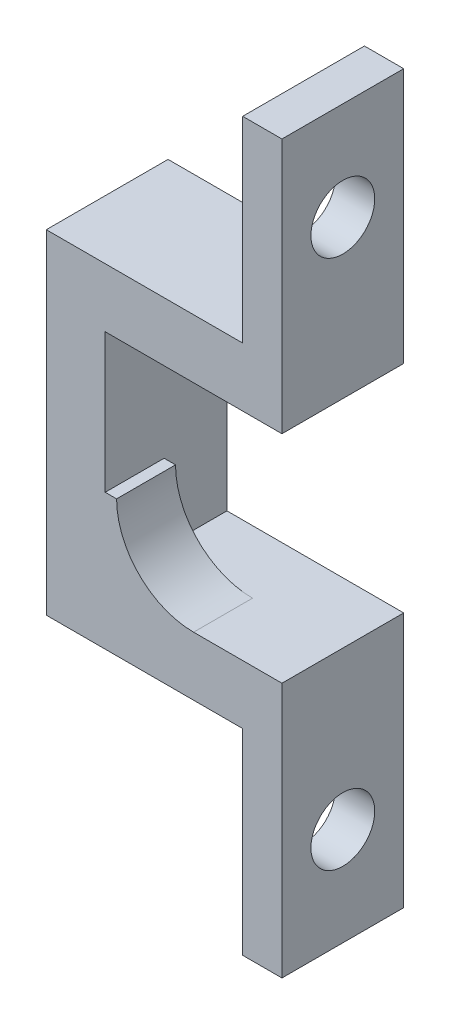
ISO-10303-21;
HEADER;
FILE_DESCRIPTION(('STEP AP214'),'2;1');
FILE_NAME('part.step','',(''),(''),'','','');
FILE_SCHEMA(('AUTOMOTIVE_DESIGN { 1 0 10303 214 1 1 1 1 }'));
ENDSEC;
DATA;
#1=APPLICATION_CONTEXT('core data for automotive mechanical design processes');
#2=APPLICATION_PROTOCOL_DEFINITION('international standard','automotive_design',2000,#1);
#3=PRODUCT_CONTEXT('',#1,'mechanical');
#4=PRODUCT('Part','Part','',(#3));
#5=PRODUCT_RELATED_PRODUCT_CATEGORY('part','',(#4));
#6=PRODUCT_DEFINITION_FORMATION('','',#4);
#7=PRODUCT_DEFINITION_CONTEXT('part definition',#1,'design');
#8=PRODUCT_DEFINITION('design','',#6,#7);
#9=PRODUCT_DEFINITION_SHAPE('','',#8);
#10=(LENGTH_UNIT() NAMED_UNIT(*) SI_UNIT(.MILLI.,.METRE.));
#11=(NAMED_UNIT(*) PLANE_ANGLE_UNIT() SI_UNIT($,.RADIAN.));
#12=(NAMED_UNIT(*) SI_UNIT($,.STERADIAN.) SOLID_ANGLE_UNIT());
#13=UNCERTAINTY_MEASURE_WITH_UNIT(LENGTH_MEASURE(1.E-05),#10,'distance_accuracy_value','');
#14=(GEOMETRIC_REPRESENTATION_CONTEXT(3) GLOBAL_UNCERTAINTY_ASSIGNED_CONTEXT((#13)) GLOBAL_UNIT_ASSIGNED_CONTEXT((#10,
#11,#12)) REPRESENTATION_CONTEXT('',''));
#15=CARTESIAN_POINT('',(0.,0.,0.));
#16=DIRECTION('',(0.,0.,1.));
#17=DIRECTION('',(1.,0.,0.));
#18=AXIS2_PLACEMENT_3D('',#15,#16,#17);
#19=CARTESIAN_POINT('',(5.8643423431886,-8.42098501040003,3.));
#20=DIRECTION('',(0.,1.,0.));
#21=DIRECTION('',(-1.,0.,0.));
#22=AXIS2_PLACEMENT_3D('',#19,#20,#21);
#23=PLANE('',#22);
#24=DIRECTION('',(0.,0.,-1.));
#25=VECTOR('',#24,1.);
#26=CARTESIAN_POINT('',(3.8643423431886,-8.42098501040003,-3.2));
#27=LINE('',#26,#25);
#28=CARTESIAN_POINT('',(3.8643423431886,-8.42098501040003,3.));
#29=VERTEX_POINT('',#28);
#30=CARTESIAN_POINT('',(3.8643423431886,-8.42098501040003,-3.2));
#31=VERTEX_POINT('',#30);
#32=EDGE_CURVE('E55',#29,#31,#27,.T.);
#33=ORIENTED_EDGE('',*,*,#32,.F.);
#34=DIRECTION('',(1.,0.,0.));
#35=VECTOR('',#34,1.);
#36=CARTESIAN_POINT('',(5.8643423431886,-8.42098501040003,3.));
#37=LINE('',#36,#35);
#38=CARTESIAN_POINT('',(-6.1356576568114,-8.42098501040003,3.));
#39=VERTEX_POINT('',#38);
#40=EDGE_CURVE('E159',#39,#29,#37,.T.);
#41=ORIENTED_EDGE('',*,*,#40,.F.);
#42=DIRECTION('',(0.,0.,-1.));
#43=VECTOR('',#42,1.);
#44=CARTESIAN_POINT('',(-6.1356576568114,-8.42098501040003,3.));
#45=LINE('',#44,#43);
#46=CARTESIAN_POINT('',(-6.1356576568114,-8.42098501040003,-3.2));
#47=VERTEX_POINT('',#46);
#48=EDGE_CURVE('E262',#39,#47,#45,.T.);
#49=ORIENTED_EDGE('',*,*,#48,.T.);
#50=DIRECTION('',(-1.,0.,0.));
#51=VECTOR('',#50,1.);
#52=CARTESIAN_POINT('',(0.,-8.42098501040003,-3.2));
#53=LINE('',#52,#51);
#54=EDGE_CURVE('E214',#31,#47,#53,.T.);
#55=ORIENTED_EDGE('',*,*,#54,.F.);
#56=EDGE_LOOP('',(#33,#41,#49,#55));
#57=FACE_BOUND('',#56,.T.);
#58=ADVANCED_FACE('F39',(#57),#23,.F.);
#59=CARTESIAN_POINT('',(-6.1356576568114,8.57901498959997,3.));
#60=DIRECTION('',(0.,-1.,0.));
#61=DIRECTION('',(0.,0.,-1.));
#62=AXIS2_PLACEMENT_3D('',#59,#60,#61);
#63=PLANE('',#62);
#64=DIRECTION('',(0.,0.,1.));
#65=VECTOR('',#64,1.);
#66=CARTESIAN_POINT('',(3.8643423431886,8.57901498959997,3.));
#67=LINE('',#66,#65);
#68=CARTESIAN_POINT('',(3.8643423431886,8.57901498959997,-3.2));
#69=VERTEX_POINT('',#68);
#70=CARTESIAN_POINT('',(3.8643423431886,8.57901498959997,3.));
#71=VERTEX_POINT('',#70);
#72=EDGE_CURVE('E63',#69,#71,#67,.T.);
#73=ORIENTED_EDGE('',*,*,#72,.F.);
#74=DIRECTION('',(1.,0.,0.));
#75=VECTOR('',#74,1.);
#76=CARTESIAN_POINT('',(0.,8.57901498959997,-3.2));
#77=LINE('',#76,#75);
#78=CARTESIAN_POINT('',(-6.1356576568114,8.57901498959997,-3.2));
#79=VERTEX_POINT('',#78);
#80=EDGE_CURVE('E219',#79,#69,#77,.T.);
#81=ORIENTED_EDGE('',*,*,#80,.F.);
#82=DIRECTION('',(0.,0.,-1.));
#83=VECTOR('',#82,1.);
#84=CARTESIAN_POINT('',(-6.1356576568114,8.57901498959997,3.));
#85=LINE('',#84,#83);
#86=CARTESIAN_POINT('',(-6.1356576568114,8.57901498959997,3.));
#87=VERTEX_POINT('',#86);
#88=EDGE_CURVE('E265',#87,#79,#85,.T.);
#89=ORIENTED_EDGE('',*,*,#88,.F.);
#90=DIRECTION('',(-1.,0.,0.));
#91=VECTOR('',#90,1.);
#92=CARTESIAN_POINT('',(-6.1356576568114,8.57901498959997,3.));
#93=LINE('',#92,#91);
#94=EDGE_CURVE('E239',#71,#87,#93,.T.);
#95=ORIENTED_EDGE('',*,*,#94,.F.);
#96=EDGE_LOOP('',(#73,#81,#89,#95));
#97=FACE_BOUND('',#96,.T.);
#98=ADVANCED_FACE('F314',(#97),#63,.F.);
#99=CARTESIAN_POINT('',(-3.1356576568114,5.57901498959997,3.));
#100=DIRECTION('',(-1.,0.,0.));
#101=DIRECTION('',(0.,-1.,0.));
#102=AXIS2_PLACEMENT_3D('',#99,#100,#101);
#103=PLANE('',#102);
#104=DIRECTION('',(0.,0.,-1.));
#105=VECTOR('',#104,1.);
#106=CARTESIAN_POINT('',(-3.1356576568114,-1.50098501040003,3.));
#107=LINE('',#106,#105);
#108=CARTESIAN_POINT('',(-3.1356576568114,-1.50098501040003,3.));
#109=VERTEX_POINT('',#108);
#110=CARTESIAN_POINT('',(-3.1356576568114,-1.50098501040003,0.));
#111=VERTEX_POINT('',#110);
#112=EDGE_CURVE('E249',#109,#111,#107,.T.);
#113=ORIENTED_EDGE('',*,*,#112,.T.);
#114=DIRECTION('',(0.,1.,0.));
#115=VECTOR('',#114,1.);
#116=CARTESIAN_POINT('',(-3.1356576568114,0.,0.));
#117=LINE('',#116,#115);
#118=CARTESIAN_POINT('',(-3.1356576568114,-5.42098501040002,0.));
#119=VERTEX_POINT('',#118);
#120=EDGE_CURVE('E205',#119,#111,#117,.T.);
#121=ORIENTED_EDGE('',*,*,#120,.F.);
#122=DIRECTION('',(0.,0.,1.));
#123=VECTOR('',#122,1.);
#124=CARTESIAN_POINT('',(-3.1356576568114,-5.42098501040002,-3.2));
#125=LINE('',#124,#123);
#126=CARTESIAN_POINT('',(-3.1356576568114,-5.42098501040002,-3.2));
#127=VERTEX_POINT('',#126);
#128=EDGE_CURVE('E227',#127,#119,#125,.T.);
#129=ORIENTED_EDGE('',*,*,#128,.F.);
#130=DIRECTION('',(0.,1.,0.));
#131=VECTOR('',#130,1.);
#132=CARTESIAN_POINT('',(-3.1356576568114,0.,-3.2));
#133=LINE('',#132,#131);
#134=CARTESIAN_POINT('',(-3.1356576568114,5.57901498959997,-3.2));
#135=VERTEX_POINT('',#134);
#136=EDGE_CURVE('E206',#127,#135,#133,.T.);
#137=ORIENTED_EDGE('',*,*,#136,.T.);
#138=DIRECTION('',(0.,0.,-1.));
#139=VECTOR('',#138,1.);
#140=CARTESIAN_POINT('',(-3.1356576568114,5.57901498959997,3.));
#141=LINE('',#140,#139);
#142=CARTESIAN_POINT('',(-3.1356576568114,5.57901498959997,3.));
#143=VERTEX_POINT('',#142);
#144=EDGE_CURVE('E43',#143,#135,#141,.T.);
#145=ORIENTED_EDGE('',*,*,#144,.F.);
#146=DIRECTION('',(0.,1.,0.));
#147=VECTOR('',#146,1.);
#148=CARTESIAN_POINT('',(-3.1356576568114,5.57901498959997,3.));
#149=LINE('',#148,#147);
#150=EDGE_CURVE('E232',#109,#143,#149,.T.);
#151=ORIENTED_EDGE('',*,*,#150,.F.);
#152=EDGE_LOOP('',(#113,#121,#129,#137,#145,#151));
#153=FACE_BOUND('',#152,.T.);
#154=ADVANCED_FACE('F41',(#153),#103,.F.);
#155=CARTESIAN_POINT('',(-3.1356576568114,5.57901498959997,3.));
#156=DIRECTION('',(0.,1.,0.));
#157=DIRECTION('',(0.,0.,1.));
#158=AXIS2_PLACEMENT_3D('',#155,#156,#157);
#159=PLANE('',#158);
#160=ORIENTED_EDGE('',*,*,#144,.T.);
#161=DIRECTION('',(-1.,0.,0.));
#162=VECTOR('',#161,1.);
#163=CARTESIAN_POINT('',(0.,5.57901498959997,-3.2));
#164=LINE('',#163,#162);
#165=CARTESIAN_POINT('',(5.8643423431886,5.57901498959997,-3.2));
#166=VERTEX_POINT('',#165);
#167=EDGE_CURVE('E224',#166,#135,#164,.T.);
#168=ORIENTED_EDGE('',*,*,#167,.F.);
#169=DIRECTION('',(0.,0.,-1.));
#170=VECTOR('',#169,1.);
#171=CARTESIAN_POINT('',(5.8643423431886,5.57901498959997,3.));
#172=LINE('',#171,#170);
#173=CARTESIAN_POINT('',(5.8643423431886,5.57901498959997,3.));
#174=VERTEX_POINT('',#173);
#175=EDGE_CURVE('E266',#174,#166,#172,.T.);
#176=ORIENTED_EDGE('',*,*,#175,.F.);
#177=DIRECTION('',(1.,0.,0.));
#178=VECTOR('',#177,1.);
#179=CARTESIAN_POINT('',(-3.1356576568114,5.57901498959997,3.));
#180=LINE('',#179,#178);
#181=EDGE_CURVE('E234',#143,#174,#180,.T.);
#182=ORIENTED_EDGE('',*,*,#181,.F.);
#183=EDGE_LOOP('',(#160,#168,#176,#182));
#184=FACE_BOUND('',#183,.T.);
#185=ADVANCED_FACE('F273',(#184),#159,.F.);
#186=CARTESIAN_POINT('',(5.8643423431886,8.57901498959997,3.));
#187=DIRECTION('',(-1.,0.,0.));
#188=DIRECTION('',(0.,-1.,0.));
#189=AXIS2_PLACEMENT_3D('',#186,#187,#188);
#190=PLANE('',#189);
#191=CARTESIAN_POINT('',(5.86434234318859,13.5790149896,-0.0999999999999995));
#192=DIRECTION('',(-1.,0.,0.));
#193=DIRECTION('',(0.,-1.,0.));
#194=AXIS2_PLACEMENT_3D('',#191,#192,#193);
#195=CIRCLE('',#194,1.625);
#196=CARTESIAN_POINT('',(5.86434234318859,11.9540149896,-0.0999999999999995));
#197=VERTEX_POINT('',#196);
#198=EDGE_CURVE('E179',#197,#197,#195,.F.);
#199=ORIENTED_EDGE('',*,*,#198,.F.);
#200=EDGE_LOOP('',(#199));
#201=FACE_BOUND('',#200,.T.);
#202=ORIENTED_EDGE('',*,*,#175,.T.);
#203=DIRECTION('',(0.,-1.,0.));
#204=VECTOR('',#203,1.);
#205=CARTESIAN_POINT('',(5.8643423431886,0.,-3.2));
#206=LINE('',#205,#204);
#207=CARTESIAN_POINT('',(5.8643423431886,18.5790149896,-3.2));
#208=VERTEX_POINT('',#207);
#209=EDGE_CURVE('E221',#208,#166,#206,.T.);
#210=ORIENTED_EDGE('',*,*,#209,.F.);
#211=DIRECTION('',(0.,0.,-1.));
#212=VECTOR('',#211,1.);
#213=CARTESIAN_POINT('',(5.8643423431886,18.5790149896,3.));
#214=LINE('',#213,#212);
#215=CARTESIAN_POINT('',(5.8643423431886,18.5790149896,3.));
#216=VERTEX_POINT('',#215);
#217=EDGE_CURVE('E188',#216,#208,#214,.T.);
#218=ORIENTED_EDGE('',*,*,#217,.F.);
#219=DIRECTION('',(0.,1.,0.));
#220=VECTOR('',#219,1.);
#221=CARTESIAN_POINT('',(5.8643423431886,8.57901498959997,3.));
#222=LINE('',#221,#220);
#223=EDGE_CURVE('E237',#174,#216,#222,.T.);
#224=ORIENTED_EDGE('',*,*,#223,.F.);
#225=EDGE_LOOP('',(#202,#210,#218,#224));
#226=FACE_BOUND('',#225,.T.);
#227=ADVANCED_FACE('F325',(#201,#226),#190,.F.);
#228=CARTESIAN_POINT('',(-6.1356576568114,-8.42098501040003,3.));
#229=DIRECTION('',(1.,0.,0.));
#230=DIRECTION('',(0.,1.,0.));
#231=AXIS2_PLACEMENT_3D('',#228,#229,#230);
#232=PLANE('',#231);
#233=ORIENTED_EDGE('',*,*,#88,.T.);
#234=DIRECTION('',(0.,1.,0.));
#235=VECTOR('',#234,1.);
#236=CARTESIAN_POINT('',(-6.1356576568114,0.,-3.2));
#237=LINE('',#236,#235);
#238=EDGE_CURVE('E216',#47,#79,#237,.T.);
#239=ORIENTED_EDGE('',*,*,#238,.F.);
#240=ORIENTED_EDGE('',*,*,#48,.F.);
#241=DIRECTION('',(0.,-1.,0.));
#242=VECTOR('',#241,1.);
#243=CARTESIAN_POINT('',(-6.1356576568114,-8.42098501040003,3.));
#244=LINE('',#243,#242);
#245=EDGE_CURVE('E241',#87,#39,#244,.T.);
#246=ORIENTED_EDGE('',*,*,#245,.F.);
#247=EDGE_LOOP('',(#233,#239,#240,#246));
#248=FACE_BOUND('',#247,.T.);
#249=ADVANCED_FACE('F323',(#248),#232,.F.);
#250=CARTESIAN_POINT('',(5.8643423431886,-5.42098501040002,3.));
#251=DIRECTION('',(-1.,0.,0.));
#252=DIRECTION('',(0.,0.,1.));
#253=AXIS2_PLACEMENT_3D('',#250,#251,#252);
#254=PLANE('',#253);
#255=CARTESIAN_POINT('',(5.8643423431886,-13.4209850104,-0.0999999999999995));
#256=DIRECTION('',(-1.,0.,0.));
#257=DIRECTION('',(0.,0.,1.));
#258=AXIS2_PLACEMENT_3D('',#255,#256,#257);
#259=CIRCLE('',#258,1.625);
#260=CARTESIAN_POINT('',(5.8643423431886,-13.4209850104,1.525));
#261=VERTEX_POINT('',#260);
#262=EDGE_CURVE('E176',#261,#261,#259,.F.);
#263=ORIENTED_EDGE('',*,*,#262,.F.);
#264=EDGE_LOOP('',(#263));
#265=FACE_BOUND('',#264,.T.);
#266=DIRECTION('',(0.,1.,0.));
#267=VECTOR('',#266,1.);
#268=CARTESIAN_POINT('',(5.8643423431886,-5.42098501040002,3.));
#269=LINE('',#268,#267);
#270=CARTESIAN_POINT('',(5.8643423431886,-18.4209850104,3.));
#271=VERTEX_POINT('',#270);
#272=CARTESIAN_POINT('',(5.8643423431886,-5.42098501040002,3.));
#273=VERTEX_POINT('',#272);
#274=EDGE_CURVE('E149',#271,#273,#269,.T.);
#275=ORIENTED_EDGE('',*,*,#274,.F.);
#276=DIRECTION('',(0.,0.,1.));
#277=VECTOR('',#276,1.);
#278=CARTESIAN_POINT('',(5.8643423431886,-18.4209850104,-3.2));
#279=LINE('',#278,#277);
#280=CARTESIAN_POINT('',(5.8643423431886,-18.4209850104,-3.2));
#281=VERTEX_POINT('',#280);
#282=EDGE_CURVE('E154',#281,#271,#279,.T.);
#283=ORIENTED_EDGE('',*,*,#282,.F.);
#284=DIRECTION('',(0.,-1.,0.));
#285=VECTOR('',#284,1.);
#286=CARTESIAN_POINT('',(5.8643423431886,0.,-3.2));
#287=LINE('',#286,#285);
#288=CARTESIAN_POINT('',(5.8643423431886,-5.42098501040002,-3.2));
#289=VERTEX_POINT('',#288);
#290=EDGE_CURVE('E212',#289,#281,#287,.T.);
#291=ORIENTED_EDGE('',*,*,#290,.F.);
#292=DIRECTION('',(0.,0.,-1.));
#293=VECTOR('',#292,1.);
#294=CARTESIAN_POINT('',(5.8643423431886,-5.42098501040002,3.));
#295=LINE('',#294,#293);
#296=EDGE_CURVE('E155',#273,#289,#295,.T.);
#297=ORIENTED_EDGE('',*,*,#296,.F.);
#298=EDGE_LOOP('',(#275,#283,#291,#297));
#299=FACE_BOUND('',#298,.T.);
#300=ADVANCED_FACE('F151',(#265,#299),#254,.F.);
#301=CARTESIAN_POINT('',(1.3643423431886,-5.42098501040002,3.));
#302=DIRECTION('',(0.,-1.,0.));
#303=DIRECTION('',(0.,0.,-1.));
#304=AXIS2_PLACEMENT_3D('',#301,#302,#303);
#305=PLANE('',#304);
#306=ORIENTED_EDGE('',*,*,#296,.T.);
#307=DIRECTION('',(-1.,0.,0.));
#308=VECTOR('',#307,1.);
#309=CARTESIAN_POINT('',(0.,-5.42098501040002,-3.2));
#310=LINE('',#309,#308);
#311=EDGE_CURVE('E209',#289,#127,#310,.T.);
#312=ORIENTED_EDGE('',*,*,#311,.T.);
#313=ORIENTED_EDGE('',*,*,#128,.T.);
#314=DIRECTION('',(-1.,0.,0.));
#315=VECTOR('',#314,1.);
#316=CARTESIAN_POINT('',(0.,-5.42098501040002,0.));
#317=LINE('',#316,#315);
#318=CARTESIAN_POINT('',(1.3643423431886,-5.42098501040002,0.));
#319=VERTEX_POINT('',#318);
#320=EDGE_CURVE('E11',#319,#119,#317,.T.);
#321=ORIENTED_EDGE('',*,*,#320,.F.);
#322=DIRECTION('',(0.,0.,-1.));
#323=VECTOR('',#322,1.);
#324=CARTESIAN_POINT('',(1.3643423431886,-5.42098501040002,3.));
#325=LINE('',#324,#323);
#326=CARTESIAN_POINT('',(1.3643423431886,-5.42098501040002,3.));
#327=VERTEX_POINT('',#326);
#328=EDGE_CURVE('E258',#327,#319,#325,.T.);
#329=ORIENTED_EDGE('',*,*,#328,.F.);
#330=DIRECTION('',(-1.,0.,0.));
#331=VECTOR('',#330,1.);
#332=CARTESIAN_POINT('',(1.3643423431886,-5.42098501040002,3.));
#333=LINE('',#332,#331);
#334=EDGE_CURVE('E158',#273,#327,#333,.T.);
#335=ORIENTED_EDGE('',*,*,#334,.F.);
#336=EDGE_LOOP('',(#306,#312,#313,#321,#329,#335));
#337=FACE_BOUND('',#336,.T.);
#338=ADVANCED_FACE('F282',(#337),#305,.F.);
#339=CARTESIAN_POINT('',(1.3643423431886,-1.50098501040003,3.));
#340=DIRECTION('',(0.,0.,-1.));
#341=DIRECTION('',(-1.,0.,0.));
#342=AXIS2_PLACEMENT_3D('',#339,#340,#341);
#343=CYLINDRICAL_SURFACE('',#342,3.92);
#344=CARTESIAN_POINT('',(1.3643423431886,-1.50098501040003,0.));
#345=DIRECTION('',(0.,0.,-1.));
#346=DIRECTION('',(1.,0.,0.));
#347=AXIS2_PLACEMENT_3D('',#344,#345,#346);
#348=CIRCLE('',#347,3.92);
#349=CARTESIAN_POINT('',(-2.5556576568114,-1.50098501040002,0.));
#350=VERTEX_POINT('',#349);
#351=EDGE_CURVE('E231',#319,#350,#348,.T.);
#352=ORIENTED_EDGE('',*,*,#351,.T.);
#353=DIRECTION('',(0.,0.,-1.));
#354=VECTOR('',#353,1.);
#355=CARTESIAN_POINT('',(-2.5556576568114,-1.50098501040002,3.));
#356=LINE('',#355,#354);
#357=CARTESIAN_POINT('',(-2.5556576568114,-1.50098501040002,3.));
#358=VERTEX_POINT('',#357);
#359=EDGE_CURVE('E255',#358,#350,#356,.T.);
#360=ORIENTED_EDGE('',*,*,#359,.F.);
#361=CARTESIAN_POINT('',(1.3643423431886,-1.50098501040003,3.));
#362=DIRECTION('',(0.,0.,-1.));
#363=DIRECTION('',(1.,0.,0.));
#364=AXIS2_PLACEMENT_3D('',#361,#362,#363);
#365=CIRCLE('',#364,3.92);
#366=EDGE_CURVE('E245',#327,#358,#365,.T.);
#367=ORIENTED_EDGE('',*,*,#366,.F.);
#368=ORIENTED_EDGE('',*,*,#328,.T.);
#369=EDGE_LOOP('',(#352,#360,#367,#368));
#370=FACE_BOUND('',#369,.T.);
#371=ADVANCED_FACE('F290',(#370),#343,.F.);
#372=CARTESIAN_POINT('',(-2.5556576568114,-1.50098501040003,3.));
#373=DIRECTION('',(0.,-1.,0.));
#374=DIRECTION('',(0.,0.,-1.));
#375=AXIS2_PLACEMENT_3D('',#372,#373,#374);
#376=PLANE('',#375);
#377=DIRECTION('',(-1.,0.,0.));
#378=VECTOR('',#377,1.);
#379=CARTESIAN_POINT('',(-2.5556576568114,-1.50098501040003,0.));
#380=LINE('',#379,#378);
#381=EDGE_CURVE('E235',#350,#111,#380,.T.);
#382=ORIENTED_EDGE('',*,*,#381,.T.);
#383=ORIENTED_EDGE('',*,*,#112,.F.);
#384=DIRECTION('',(-1.,0.,0.));
#385=VECTOR('',#384,1.);
#386=CARTESIAN_POINT('',(-2.5556576568114,-1.50098501040003,3.));
#387=LINE('',#386,#385);
#388=EDGE_CURVE('E247',#358,#109,#387,.T.);
#389=ORIENTED_EDGE('',*,*,#388,.F.);
#390=ORIENTED_EDGE('',*,*,#359,.T.);
#391=EDGE_LOOP('',(#382,#383,#389,#390));
#392=FACE_BOUND('',#391,.T.);
#393=ADVANCED_FACE('F294',(#392),#376,.F.);
#394=CARTESIAN_POINT('',(1.3643423431886,-1.50098501040003,3.));
#395=DIRECTION('',(0.,0.,1.));
#396=DIRECTION('',(1.,0.,0.));
#397=AXIS2_PLACEMENT_3D('',#394,#395,#396);
#398=PLANE('',#397);
#399=ORIENTED_EDGE('',*,*,#150,.T.);
#400=ORIENTED_EDGE('',*,*,#181,.T.);
#401=ORIENTED_EDGE('',*,*,#223,.T.);
#402=DIRECTION('',(1.,0.,0.));
#403=VECTOR('',#402,1.);
#404=CARTESIAN_POINT('',(5.8643423431886,18.5790149896,3.));
#405=LINE('',#404,#403);
#406=CARTESIAN_POINT('',(3.8643423431886,18.5790149896,3.));
#407=VERTEX_POINT('',#406);
#408=EDGE_CURVE('E195',#407,#216,#405,.T.);
#409=ORIENTED_EDGE('',*,*,#408,.F.);
#410=DIRECTION('',(0.,-1.,0.));
#411=VECTOR('',#410,1.);
#412=CARTESIAN_POINT('',(3.8643423431886,18.5790149896,3.));
#413=LINE('',#412,#411);
#414=EDGE_CURVE('E198',#407,#71,#413,.T.);
#415=ORIENTED_EDGE('',*,*,#414,.T.);
#416=ORIENTED_EDGE('',*,*,#94,.T.);
#417=ORIENTED_EDGE('',*,*,#245,.T.);
#418=ORIENTED_EDGE('',*,*,#40,.T.);
#419=DIRECTION('',(0.,1.,0.));
#420=VECTOR('',#419,1.);
#421=CARTESIAN_POINT('',(3.8643423431886,-18.4209850104,3.));
#422=LINE('',#421,#420);
#423=CARTESIAN_POINT('',(3.8643423431886,-18.4209850104,3.));
#424=VERTEX_POINT('',#423);
#425=EDGE_CURVE('E166',#424,#29,#422,.T.);
#426=ORIENTED_EDGE('',*,*,#425,.F.);
#427=DIRECTION('',(-1.,0.,0.));
#428=VECTOR('',#427,1.);
#429=CARTESIAN_POINT('',(5.8643423431886,-18.4209850104,3.));
#430=LINE('',#429,#428);
#431=EDGE_CURVE('E162',#271,#424,#430,.T.);
#432=ORIENTED_EDGE('',*,*,#431,.F.);
#433=ORIENTED_EDGE('',*,*,#274,.T.);
#434=ORIENTED_EDGE('',*,*,#334,.T.);
#435=ORIENTED_EDGE('',*,*,#366,.T.);
#436=ORIENTED_EDGE('',*,*,#388,.T.);
#437=EDGE_LOOP('',(#399,#400,#401,#409,#415,#416,#417,#418,#426,#432,#433,#434,#435,#436));
#438=FACE_BOUND('',#437,.T.);
#439=ADVANCED_FACE('F164',(#438),#398,.T.);
#440=CARTESIAN_POINT('',(1.3643423431886,-1.50098501040003,0.));
#441=DIRECTION('',(0.,0.,1.));
#442=DIRECTION('',(1.,0.,0.));
#443=AXIS2_PLACEMENT_3D('',#440,#441,#442);
#444=PLANE('',#443);
#445=ORIENTED_EDGE('',*,*,#320,.T.);
#446=ORIENTED_EDGE('',*,*,#120,.T.);
#447=ORIENTED_EDGE('',*,*,#381,.F.);
#448=ORIENTED_EDGE('',*,*,#351,.F.);
#449=EDGE_LOOP('',(#445,#446,#447,#448));
#450=FACE_BOUND('',#449,.T.);
#451=ADVANCED_FACE('F286',(#450),#444,.F.);
#452=CARTESIAN_POINT('',(0.,0.,-3.2));
#453=DIRECTION('',(0.,0.,-1.));
#454=DIRECTION('',(-1.,0.,0.));
#455=AXIS2_PLACEMENT_3D('',#452,#453,#454);
#456=PLANE('',#455);
#457=ORIENTED_EDGE('',*,*,#136,.F.);
#458=ORIENTED_EDGE('',*,*,#311,.F.);
#459=ORIENTED_EDGE('',*,*,#290,.T.);
#460=DIRECTION('',(1.,0.,0.));
#461=VECTOR('',#460,1.);
#462=CARTESIAN_POINT('',(5.8643423431886,-18.4209850104,-3.2));
#463=LINE('',#462,#461);
#464=CARTESIAN_POINT('',(3.8643423431886,-18.4209850104,-3.2));
#465=VERTEX_POINT('',#464);
#466=EDGE_CURVE('E174',#465,#281,#463,.T.);
#467=ORIENTED_EDGE('',*,*,#466,.F.);
#468=DIRECTION('',(0.,1.,0.));
#469=VECTOR('',#468,1.);
#470=CARTESIAN_POINT('',(3.8643423431886,-18.4209850104,-3.2));
#471=LINE('',#470,#469);
#472=EDGE_CURVE('E183',#465,#31,#471,.T.);
#473=ORIENTED_EDGE('',*,*,#472,.T.);
#474=ORIENTED_EDGE('',*,*,#54,.T.);
#475=ORIENTED_EDGE('',*,*,#238,.T.);
#476=ORIENTED_EDGE('',*,*,#80,.T.);
#477=DIRECTION('',(0.,-1.,0.));
#478=VECTOR('',#477,1.);
#479=CARTESIAN_POINT('',(3.8643423431886,18.5790149896,-3.2));
#480=LINE('',#479,#478);
#481=CARTESIAN_POINT('',(3.8643423431886,18.5790149896,-3.2));
#482=VERTEX_POINT('',#481);
#483=EDGE_CURVE('E202',#482,#69,#480,.T.);
#484=ORIENTED_EDGE('',*,*,#483,.F.);
#485=DIRECTION('',(-1.,0.,0.));
#486=VECTOR('',#485,1.);
#487=CARTESIAN_POINT('',(5.8643423431886,18.5790149896,-3.2));
#488=LINE('',#487,#486);
#489=EDGE_CURVE('E191',#208,#482,#488,.T.);
#490=ORIENTED_EDGE('',*,*,#489,.F.);
#491=ORIENTED_EDGE('',*,*,#209,.T.);
#492=ORIENTED_EDGE('',*,*,#167,.T.);
#493=EDGE_LOOP('',(#457,#458,#459,#467,#473,#474,#475,#476,#484,#490,#491,#492));
#494=FACE_BOUND('',#493,.T.);
#495=ADVANCED_FACE('F278',(#494),#456,.T.);
#496=CARTESIAN_POINT('',(3.8643423431886,18.5790149896,3.));
#497=DIRECTION('',(1.,0.,0.));
#498=DIRECTION('',(0.,0.,-1.));
#499=AXIS2_PLACEMENT_3D('',#496,#497,#498);
#500=PLANE('',#499);
#501=CARTESIAN_POINT('',(3.8643423431886,13.5790149896,-0.0999999999999994));
#502=DIRECTION('',(-1.,0.,0.));
#503=DIRECTION('',(0.,-1.,0.));
#504=AXIS2_PLACEMENT_3D('',#501,#502,#503);
#505=CIRCLE('',#504,1.625);
#506=CARTESIAN_POINT('',(3.8643423431886,11.9540149896,-0.0999999999999994));
#507=VERTEX_POINT('',#506);
#508=EDGE_CURVE('E439',#507,#507,#505,.T.);
#509=ORIENTED_EDGE('',*,*,#508,.F.);
#510=EDGE_LOOP('',(#509));
#511=FACE_BOUND('',#510,.T.);
#512=ORIENTED_EDGE('',*,*,#72,.T.);
#513=ORIENTED_EDGE('',*,*,#414,.F.);
#514=DIRECTION('',(0.,0.,1.));
#515=VECTOR('',#514,1.);
#516=CARTESIAN_POINT('',(3.8643423431886,18.5790149896,3.));
#517=LINE('',#516,#515);
#518=EDGE_CURVE('E193',#482,#407,#517,.T.);
#519=ORIENTED_EDGE('',*,*,#518,.F.);
#520=ORIENTED_EDGE('',*,*,#483,.T.);
#521=EDGE_LOOP('',(#512,#513,#519,#520));
#522=FACE_BOUND('',#521,.T.);
#523=ADVANCED_FACE('F309',(#511,#522),#500,.F.);
#524=CARTESIAN_POINT('',(0.,18.5790149896,0.));
#525=DIRECTION('',(0.,1.,0.));
#526=DIRECTION('',(0.,0.,1.));
#527=AXIS2_PLACEMENT_3D('',#524,#525,#526);
#528=PLANE('',#527);
#529=ORIENTED_EDGE('',*,*,#217,.T.);
#530=ORIENTED_EDGE('',*,*,#489,.T.);
#531=ORIENTED_EDGE('',*,*,#518,.T.);
#532=ORIENTED_EDGE('',*,*,#408,.T.);
#533=EDGE_LOOP('',(#529,#530,#531,#532));
#534=FACE_BOUND('',#533,.T.);
#535=ADVANCED_FACE('F300',(#534),#528,.T.);
#536=CARTESIAN_POINT('',(3.8643423431886,-18.4209850104,-3.2));
#537=DIRECTION('',(1.,0.,0.));
#538=DIRECTION('',(0.,1.,0.));
#539=AXIS2_PLACEMENT_3D('',#536,#537,#538);
#540=PLANE('',#539);
#541=CARTESIAN_POINT('',(3.8643423431886,-13.4209850104,-0.0999999999999994));
#542=DIRECTION('',(-1.,0.,0.));
#543=DIRECTION('',(0.,-1.,0.));
#544=AXIS2_PLACEMENT_3D('',#541,#542,#543);
#545=CIRCLE('',#544,1.625);
#546=CARTESIAN_POINT('',(3.8643423431886,-15.0459850104,-0.0999999999999994));
#547=VERTEX_POINT('',#546);
#548=EDGE_CURVE('E442',#547,#547,#545,.T.);
#549=ORIENTED_EDGE('',*,*,#548,.F.);
#550=EDGE_LOOP('',(#549));
#551=FACE_BOUND('',#550,.T.);
#552=ORIENTED_EDGE('',*,*,#32,.T.);
#553=ORIENTED_EDGE('',*,*,#472,.F.);
#554=DIRECTION('',(0.,0.,-1.));
#555=VECTOR('',#554,1.);
#556=CARTESIAN_POINT('',(3.8643423431886,-18.4209850104,-3.2));
#557=LINE('',#556,#555);
#558=EDGE_CURVE('E169',#424,#465,#557,.T.);
#559=ORIENTED_EDGE('',*,*,#558,.F.);
#560=ORIENTED_EDGE('',*,*,#425,.T.);
#561=EDGE_LOOP('',(#552,#553,#559,#560));
#562=FACE_BOUND('',#561,.T.);
#563=ADVANCED_FACE('F298',(#551,#562),#540,.F.);
#564=CARTESIAN_POINT('',(0.,-18.4209850104,0.));
#565=DIRECTION('',(0.,-1.,0.));
#566=DIRECTION('',(0.,0.,-1.));
#567=AXIS2_PLACEMENT_3D('',#564,#565,#566);
#568=PLANE('',#567);
#569=ORIENTED_EDGE('',*,*,#282,.T.);
#570=ORIENTED_EDGE('',*,*,#431,.T.);
#571=ORIENTED_EDGE('',*,*,#558,.T.);
#572=ORIENTED_EDGE('',*,*,#466,.T.);
#573=EDGE_LOOP('',(#569,#570,#571,#572));
#574=FACE_BOUND('',#573,.T.);
#575=ADVANCED_FACE('F172',(#574),#568,.T.);
#576=CARTESIAN_POINT('',(5.86534234318861,-13.4209850104,-0.0999999999999995));
#577=DIRECTION('',(-1.,0.,0.));
#578=DIRECTION('',(0.,-1.,0.));
#579=AXIS2_PLACEMENT_3D('',#576,#577,#578);
#580=CYLINDRICAL_SURFACE('',#579,1.625);
#581=ORIENTED_EDGE('',*,*,#548,.T.);
#582=EDGE_LOOP('',(#581));
#583=FACE_BOUND('',#582,.T.);
#584=ORIENTED_EDGE('',*,*,#262,.T.);
#585=EDGE_LOOP('',(#584));
#586=FACE_BOUND('',#585,.T.);
#587=ADVANCED_FACE('F307',(#583,#586),#580,.F.);
#588=CARTESIAN_POINT('',(5.8653423431886,13.5790149896,-0.0999999999999995));
#589=DIRECTION('',(-1.,0.,0.));
#590=DIRECTION('',(0.,-1.,0.));
#591=AXIS2_PLACEMENT_3D('',#588,#589,#590);
#592=CYLINDRICAL_SURFACE('',#591,1.625);
#593=ORIENTED_EDGE('',*,*,#508,.T.);
#594=EDGE_LOOP('',(#593));
#595=FACE_BOUND('',#594,.T.);
#596=ORIENTED_EDGE('',*,*,#198,.T.);
#597=EDGE_LOOP('',(#596));
#598=FACE_BOUND('',#597,.T.);
#599=ADVANCED_FACE('F422',(#595,#598),#592,.F.);
#600=CLOSED_SHELL('',(#58,#98,#154,#185,#227,#249,#300,#338,#371,#393,#439,#451,#495,#523,#535,
#563,#575,#587,#599));
#601=MANIFOLD_SOLID_BREP('B2',#600);
#602=ADVANCED_BREP_SHAPE_REPRESENTATION('',(#18,#601),#14);
#603=SHAPE_DEFINITION_REPRESENTATION(#9,#602);
ENDSEC;
END-ISO-10303-21;
